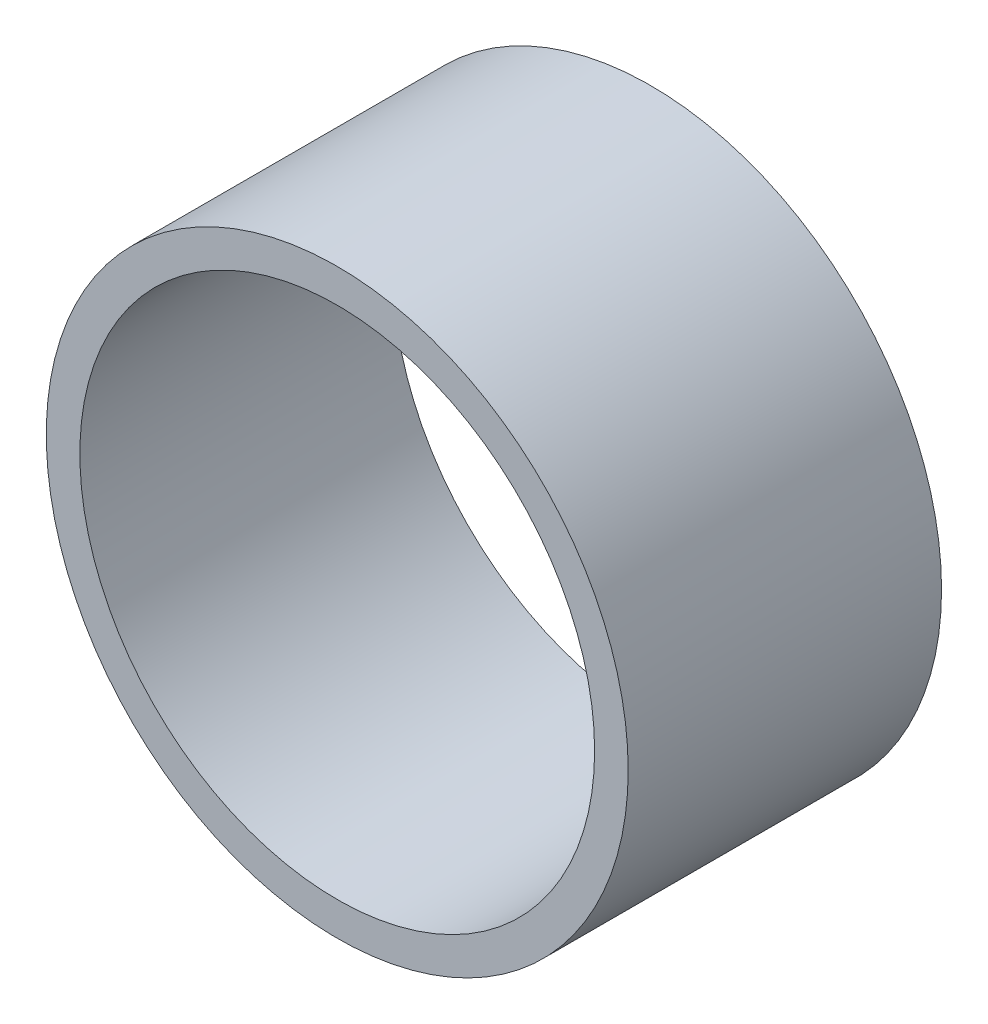
ISO-10303-21;
HEADER;
FILE_DESCRIPTION(('STEP AP214'),'2;1');
FILE_NAME('part.step','',(''),(''),'','','');
FILE_SCHEMA(('AUTOMOTIVE_DESIGN { 1 0 10303 214 1 1 1 1 }'));
ENDSEC;
DATA;
#1=APPLICATION_CONTEXT('core data for automotive mechanical design processes');
#2=APPLICATION_PROTOCOL_DEFINITION('international standard','automotive_design',2000,#1);
#3=PRODUCT_CONTEXT('',#1,'mechanical');
#4=PRODUCT('Part','Part','',(#3));
#5=PRODUCT_RELATED_PRODUCT_CATEGORY('part','',(#4));
#6=PRODUCT_DEFINITION_FORMATION('','',#4);
#7=PRODUCT_DEFINITION_CONTEXT('part definition',#1,'design');
#8=PRODUCT_DEFINITION('design','',#6,#7);
#9=PRODUCT_DEFINITION_SHAPE('','',#8);
#10=(LENGTH_UNIT() NAMED_UNIT(*) SI_UNIT(.MILLI.,.METRE.));
#11=(NAMED_UNIT(*) PLANE_ANGLE_UNIT() SI_UNIT($,.RADIAN.));
#12=(NAMED_UNIT(*) SI_UNIT($,.STERADIAN.) SOLID_ANGLE_UNIT());
#13=UNCERTAINTY_MEASURE_WITH_UNIT(LENGTH_MEASURE(1.E-05),#10,'distance_accuracy_value','');
#14=(GEOMETRIC_REPRESENTATION_CONTEXT(3) GLOBAL_UNCERTAINTY_ASSIGNED_CONTEXT((#13)) GLOBAL_UNIT_ASSIGNED_CONTEXT((#10,
#11,#12)) REPRESENTATION_CONTEXT('',''));
#15=CARTESIAN_POINT('',(0.,0.,0.));
#16=DIRECTION('',(0.,0.,1.));
#17=DIRECTION('',(1.,0.,0.));
#18=AXIS2_PLACEMENT_3D('',#15,#16,#17);
#19=CARTESIAN_POINT('',(0.,0.,28.));
#20=DIRECTION('',(0.,0.,1.));
#21=DIRECTION('',(1.,0.,0.));
#22=AXIS2_PLACEMENT_3D('',#19,#20,#21);
#23=PLANE('',#22);
#24=CARTESIAN_POINT('',(0.,0.,28.));
#25=DIRECTION('',(0.,0.,1.));
#26=DIRECTION('',(1.,0.,0.));
#27=AXIS2_PLACEMENT_3D('',#24,#25,#26);
#28=CIRCLE('',#27,26.);
#29=CARTESIAN_POINT('',(26.,0.,28.));
#30=VERTEX_POINT('',#29);
#31=EDGE_CURVE('E10',#30,#30,#28,.T.);
#32=ORIENTED_EDGE('',*,*,#31,.T.);
#33=EDGE_LOOP('',(#32));
#34=FACE_BOUND('',#33,.T.);
#35=CARTESIAN_POINT('',(0.,0.,28.));
#36=DIRECTION('',(0.,0.,1.));
#37=DIRECTION('',(1.,0.,0.));
#38=AXIS2_PLACEMENT_3D('',#35,#36,#37);
#39=CIRCLE('',#38,23.);
#40=CARTESIAN_POINT('',(23.,0.,28.));
#41=VERTEX_POINT('',#40);
#42=EDGE_CURVE('E42',#41,#41,#39,.T.);
#43=ORIENTED_EDGE('',*,*,#42,.F.);
#44=EDGE_LOOP('',(#43));
#45=FACE_BOUND('',#44,.T.);
#46=ADVANCED_FACE('F31',(#34,#45),#23,.T.);
#47=CARTESIAN_POINT('',(0.,0.,0.));
#48=DIRECTION('',(0.,0.,1.));
#49=DIRECTION('',(1.,0.,0.));
#50=AXIS2_PLACEMENT_3D('',#47,#48,#49);
#51=PLANE('',#50);
#52=CARTESIAN_POINT('',(0.,0.,0.));
#53=DIRECTION('',(0.,0.,1.));
#54=DIRECTION('',(1.,0.,0.));
#55=AXIS2_PLACEMENT_3D('',#52,#53,#54);
#56=CIRCLE('',#55,26.);
#57=CARTESIAN_POINT('',(26.,0.,0.));
#58=VERTEX_POINT('',#57);
#59=EDGE_CURVE('E35',#58,#58,#56,.T.);
#60=ORIENTED_EDGE('',*,*,#59,.F.);
#61=EDGE_LOOP('',(#60));
#62=FACE_BOUND('',#61,.T.);
#63=CARTESIAN_POINT('',(0.,0.,0.));
#64=DIRECTION('',(0.,0.,1.));
#65=DIRECTION('',(1.,0.,0.));
#66=AXIS2_PLACEMENT_3D('',#63,#64,#65);
#67=CIRCLE('',#66,23.);
#68=CARTESIAN_POINT('',(23.,0.,0.));
#69=VERTEX_POINT('',#68);
#70=EDGE_CURVE('E44',#69,#69,#67,.T.);
#71=ORIENTED_EDGE('',*,*,#70,.T.);
#72=EDGE_LOOP('',(#71));
#73=FACE_BOUND('',#72,.T.);
#74=ADVANCED_FACE('F54',(#62,#73),#51,.F.);
#75=CARTESIAN_POINT('',(0.,0.,28.));
#76=DIRECTION('',(0.,0.,-1.));
#77=DIRECTION('',(-1.,0.,0.));
#78=AXIS2_PLACEMENT_3D('',#75,#76,#77);
#79=CYLINDRICAL_SURFACE('',#78,26.);
#80=ORIENTED_EDGE('',*,*,#31,.F.);
#81=EDGE_LOOP('',(#80));
#82=FACE_BOUND('',#81,.T.);
#83=ORIENTED_EDGE('',*,*,#59,.T.);
#84=EDGE_LOOP('',(#83));
#85=FACE_BOUND('',#84,.T.);
#86=ADVANCED_FACE('F33',(#82,#85),#79,.T.);
#87=CARTESIAN_POINT('',(0.,0.,28.));
#88=DIRECTION('',(0.,0.,-1.));
#89=DIRECTION('',(-1.,0.,0.));
#90=AXIS2_PLACEMENT_3D('',#87,#88,#89);
#91=CYLINDRICAL_SURFACE('',#90,23.);
#92=ORIENTED_EDGE('',*,*,#42,.T.);
#93=EDGE_LOOP('',(#92));
#94=FACE_BOUND('',#93,.T.);
#95=ORIENTED_EDGE('',*,*,#70,.F.);
#96=EDGE_LOOP('',(#95));
#97=FACE_BOUND('',#96,.T.);
#98=ADVANCED_FACE('F50',(#94,#97),#91,.F.);
#99=CLOSED_SHELL('',(#46,#74,#86,#98));
#100=MANIFOLD_SOLID_BREP('B2',#99);
#101=ADVANCED_BREP_SHAPE_REPRESENTATION('',(#18,#100),#14);
#102=SHAPE_DEFINITION_REPRESENTATION(#9,#101);
ENDSEC;
END-ISO-10303-21;
